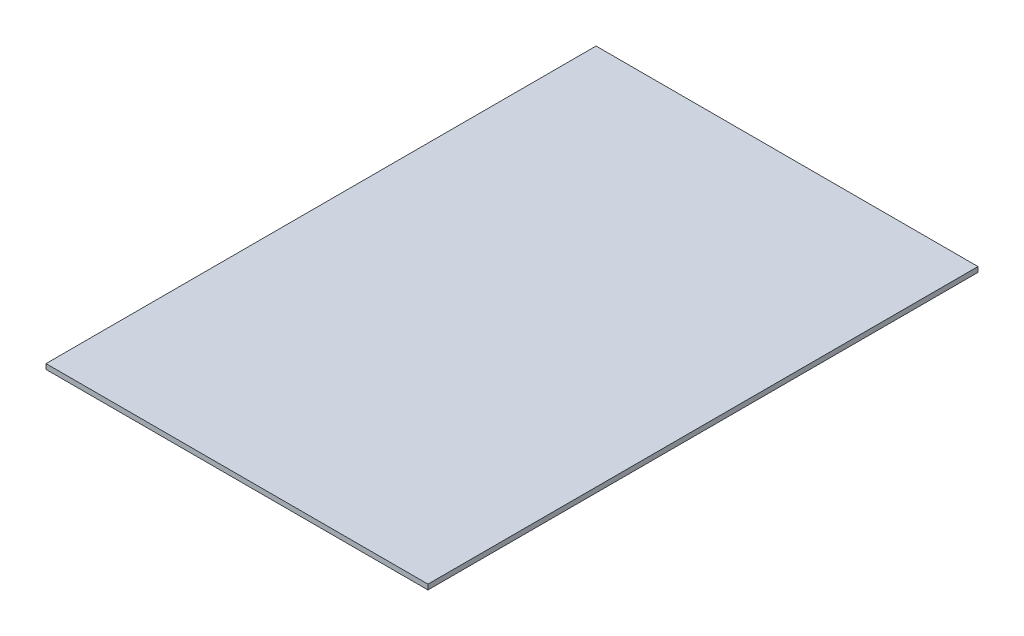
ISO-10303-21;
HEADER;
FILE_DESCRIPTION(('STEP AP214'),'2;1');
FILE_NAME('part.step','',(''),(''),'','','');
FILE_SCHEMA(('AUTOMOTIVE_DESIGN { 1 0 10303 214 1 1 1 1 }'));
ENDSEC;
DATA;
#1=APPLICATION_CONTEXT('core data for automotive mechanical design processes');
#2=APPLICATION_PROTOCOL_DEFINITION('international standard','automotive_design',2000,#1);
#3=PRODUCT_CONTEXT('',#1,'mechanical');
#4=PRODUCT('Part','Part','',(#3));
#5=PRODUCT_RELATED_PRODUCT_CATEGORY('part','',(#4));
#6=PRODUCT_DEFINITION_FORMATION('','',#4);
#7=PRODUCT_DEFINITION_CONTEXT('part definition',#1,'design');
#8=PRODUCT_DEFINITION('design','',#6,#7);
#9=PRODUCT_DEFINITION_SHAPE('','',#8);
#10=(LENGTH_UNIT() NAMED_UNIT(*) SI_UNIT(.MILLI.,.METRE.));
#11=(NAMED_UNIT(*) PLANE_ANGLE_UNIT() SI_UNIT($,.RADIAN.));
#12=(NAMED_UNIT(*) SI_UNIT($,.STERADIAN.) SOLID_ANGLE_UNIT());
#13=UNCERTAINTY_MEASURE_WITH_UNIT(LENGTH_MEASURE(1.E-05),#10,'distance_accuracy_value','');
#14=(GEOMETRIC_REPRESENTATION_CONTEXT(3) GLOBAL_UNCERTAINTY_ASSIGNED_CONTEXT((#13)) GLOBAL_UNIT_ASSIGNED_CONTEXT((#10,
#11,#12)) REPRESENTATION_CONTEXT('',''));
#15=CARTESIAN_POINT('',(0.,0.,0.));
#16=DIRECTION('',(0.,0.,1.));
#17=DIRECTION('',(1.,0.,0.));
#18=AXIS2_PLACEMENT_3D('',#15,#16,#17);
#19=CARTESIAN_POINT('',(225.4,6.,324.6));
#20=DIRECTION('',(-1.,0.,0.));
#21=DIRECTION('',(0.,0.,1.));
#22=AXIS2_PLACEMENT_3D('',#19,#20,#21);
#23=PLANE('',#22);
#24=DIRECTION('',(0.,0.,-1.));
#25=VECTOR('',#24,1.);
#26=CARTESIAN_POINT('',(225.4,0.,324.6));
#27=LINE('',#26,#25);
#28=CARTESIAN_POINT('',(225.4,0.,324.6));
#29=VERTEX_POINT('',#28);
#30=CARTESIAN_POINT('',(225.4,0.,-324.6));
#31=VERTEX_POINT('',#30);
#32=EDGE_CURVE('E98',#29,#31,#27,.T.);
#33=ORIENTED_EDGE('',*,*,#32,.T.);
#34=DIRECTION('',(0.,-1.,0.));
#35=VECTOR('',#34,1.);
#36=CARTESIAN_POINT('',(225.4,6.,-324.6));
#37=LINE('',#36,#35);
#38=CARTESIAN_POINT('',(225.4,6.,-324.6));
#39=VERTEX_POINT('',#38);
#40=EDGE_CURVE('E11',#39,#31,#37,.T.);
#41=ORIENTED_EDGE('',*,*,#40,.F.);
#42=DIRECTION('',(0.,0.,-1.));
#43=VECTOR('',#42,1.);
#44=CARTESIAN_POINT('',(225.4,6.,324.6));
#45=LINE('',#44,#43);
#46=CARTESIAN_POINT('',(225.4,6.,324.6));
#47=VERTEX_POINT('',#46);
#48=EDGE_CURVE('E86',#47,#39,#45,.T.);
#49=ORIENTED_EDGE('',*,*,#48,.F.);
#50=DIRECTION('',(0.,-1.,0.));
#51=VECTOR('',#50,1.);
#52=CARTESIAN_POINT('',(225.4,6.,324.6));
#53=LINE('',#52,#51);
#54=EDGE_CURVE('E94',#47,#29,#53,.T.);
#55=ORIENTED_EDGE('',*,*,#54,.T.);
#56=EDGE_LOOP('',(#33,#41,#49,#55));
#57=FACE_BOUND('',#56,.T.);
#58=ADVANCED_FACE('F35',(#57),#23,.F.);
#59=CARTESIAN_POINT('',(-225.4,6.,-324.6));
#60=DIRECTION('',(0.,0.,1.));
#61=DIRECTION('',(1.,0.,0.));
#62=AXIS2_PLACEMENT_3D('',#59,#60,#61);
#63=PLANE('',#62);
#64=DIRECTION('',(-1.,0.,0.));
#65=VECTOR('',#64,1.);
#66=CARTESIAN_POINT('',(-225.4,0.,-324.6));
#67=LINE('',#66,#65);
#68=CARTESIAN_POINT('',(-225.4,0.,-324.6));
#69=VERTEX_POINT('',#68);
#70=EDGE_CURVE('E90',#31,#69,#67,.T.);
#71=ORIENTED_EDGE('',*,*,#70,.T.);
#72=DIRECTION('',(0.,-1.,0.));
#73=VECTOR('',#72,1.);
#74=CARTESIAN_POINT('',(-225.4,6.,-324.6));
#75=LINE('',#74,#73);
#76=CARTESIAN_POINT('',(-225.4,6.,-324.6));
#77=VERTEX_POINT('',#76);
#78=EDGE_CURVE('E43',#77,#69,#75,.T.);
#79=ORIENTED_EDGE('',*,*,#78,.F.);
#80=DIRECTION('',(-1.,0.,0.));
#81=VECTOR('',#80,1.);
#82=CARTESIAN_POINT('',(-225.4,6.,-324.6));
#83=LINE('',#82,#81);
#84=EDGE_CURVE('E81',#39,#77,#83,.T.);
#85=ORIENTED_EDGE('',*,*,#84,.F.);
#86=ORIENTED_EDGE('',*,*,#40,.T.);
#87=EDGE_LOOP('',(#71,#79,#85,#86));
#88=FACE_BOUND('',#87,.T.);
#89=ADVANCED_FACE('F89',(#88),#63,.F.);
#90=CARTESIAN_POINT('',(-225.4,6.,324.6));
#91=DIRECTION('',(1.,0.,0.));
#92=DIRECTION('',(0.,0.,-1.));
#93=AXIS2_PLACEMENT_3D('',#90,#91,#92);
#94=PLANE('',#93);
#95=DIRECTION('',(0.,0.,1.));
#96=VECTOR('',#95,1.);
#97=CARTESIAN_POINT('',(-225.4,0.,324.6));
#98=LINE('',#97,#96);
#99=CARTESIAN_POINT('',(-225.4,0.,324.6));
#100=VERTEX_POINT('',#99);
#101=EDGE_CURVE('E68',#69,#100,#98,.T.);
#102=ORIENTED_EDGE('',*,*,#101,.T.);
#103=DIRECTION('',(0.,-1.,0.));
#104=VECTOR('',#103,1.);
#105=CARTESIAN_POINT('',(-225.4,6.,324.6));
#106=LINE('',#105,#104);
#107=CARTESIAN_POINT('',(-225.4,6.,324.6));
#108=VERTEX_POINT('',#107);
#109=EDGE_CURVE('E91',#108,#100,#106,.T.);
#110=ORIENTED_EDGE('',*,*,#109,.F.);
#111=DIRECTION('',(0.,0.,1.));
#112=VECTOR('',#111,1.);
#113=CARTESIAN_POINT('',(-225.4,6.,324.6));
#114=LINE('',#113,#112);
#115=EDGE_CURVE('E84',#77,#108,#114,.T.);
#116=ORIENTED_EDGE('',*,*,#115,.F.);
#117=ORIENTED_EDGE('',*,*,#78,.T.);
#118=EDGE_LOOP('',(#102,#110,#116,#117));
#119=FACE_BOUND('',#118,.T.);
#120=ADVANCED_FACE('F92',(#119),#94,.F.);
#121=CARTESIAN_POINT('',(-225.4,6.,324.6));
#122=DIRECTION('',(0.,0.,-1.));
#123=DIRECTION('',(-1.,0.,0.));
#124=AXIS2_PLACEMENT_3D('',#121,#122,#123);
#125=PLANE('',#124);
#126=DIRECTION('',(1.,0.,0.));
#127=VECTOR('',#126,1.);
#128=CARTESIAN_POINT('',(-225.4,0.,324.6));
#129=LINE('',#128,#127);
#130=EDGE_CURVE('E74',#100,#29,#129,.T.);
#131=ORIENTED_EDGE('',*,*,#130,.T.);
#132=ORIENTED_EDGE('',*,*,#54,.F.);
#133=DIRECTION('',(1.,0.,0.));
#134=VECTOR('',#133,1.);
#135=CARTESIAN_POINT('',(-225.4,6.,324.6));
#136=LINE('',#135,#134);
#137=EDGE_CURVE('E51',#108,#47,#136,.T.);
#138=ORIENTED_EDGE('',*,*,#137,.F.);
#139=ORIENTED_EDGE('',*,*,#109,.T.);
#140=EDGE_LOOP('',(#131,#132,#138,#139));
#141=FACE_BOUND('',#140,.T.);
#142=ADVANCED_FACE('F105',(#141),#125,.F.);
#143=CARTESIAN_POINT('',(0.,6.,0.));
#144=DIRECTION('',(0.,-1.,0.));
#145=DIRECTION('',(0.,0.,-1.));
#146=AXIS2_PLACEMENT_3D('',#143,#144,#145);
#147=PLANE('',#146);
#148=ORIENTED_EDGE('',*,*,#48,.T.);
#149=ORIENTED_EDGE('',*,*,#84,.T.);
#150=ORIENTED_EDGE('',*,*,#115,.T.);
#151=ORIENTED_EDGE('',*,*,#137,.T.);
#152=EDGE_LOOP('',(#148,#149,#150,#151));
#153=FACE_BOUND('',#152,.T.);
#154=ADVANCED_FACE('F82',(#153),#147,.F.);
#155=CARTESIAN_POINT('',(0.,0.,0.));
#156=DIRECTION('',(0.,-1.,0.));
#157=DIRECTION('',(0.,0.,-1.));
#158=AXIS2_PLACEMENT_3D('',#155,#156,#157);
#159=PLANE('',#158);
#160=ORIENTED_EDGE('',*,*,#32,.F.);
#161=ORIENTED_EDGE('',*,*,#130,.F.);
#162=ORIENTED_EDGE('',*,*,#101,.F.);
#163=ORIENTED_EDGE('',*,*,#70,.F.);
#164=EDGE_LOOP('',(#160,#161,#162,#163));
#165=FACE_BOUND('',#164,.T.);
#166=ADVANCED_FACE('F108',(#165),#159,.T.);
#167=CLOSED_SHELL('',(#58,#89,#120,#142,#154,#166));
#168=MANIFOLD_SOLID_BREP('B2',#167);
#169=ADVANCED_BREP_SHAPE_REPRESENTATION('',(#18,#168),#14);
#170=SHAPE_DEFINITION_REPRESENTATION(#9,#169);
ENDSEC;
END-ISO-10303-21;
